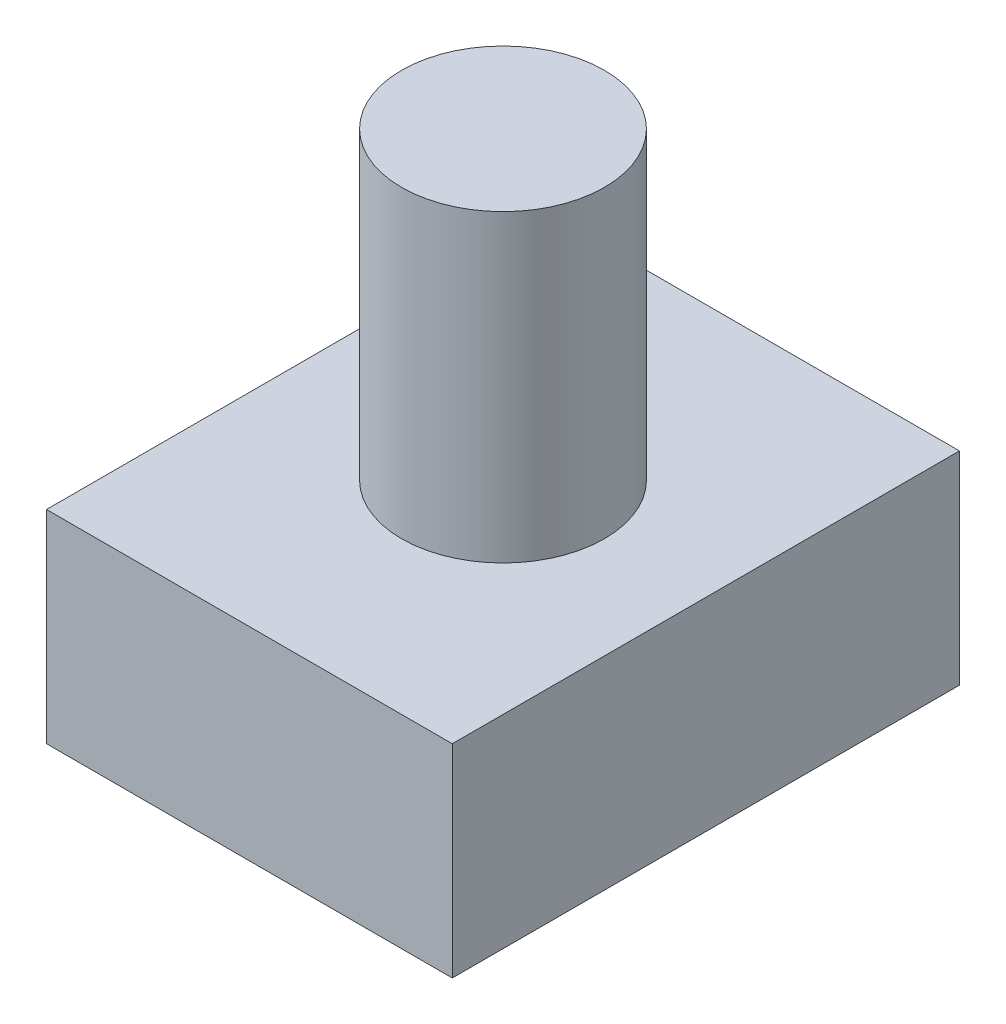
ISO-10303-21;
HEADER;
FILE_DESCRIPTION(('STEP AP214'),'2;1');
FILE_NAME('part.step','',(''),(''),'','','');
FILE_SCHEMA(('AUTOMOTIVE_DESIGN { 1 0 10303 214 1 1 1 1 }'));
ENDSEC;
DATA;
#1=APPLICATION_CONTEXT('core data for automotive mechanical design processes');
#2=APPLICATION_PROTOCOL_DEFINITION('international standard','automotive_design',2000,#1);
#3=PRODUCT_CONTEXT('',#1,'mechanical');
#4=PRODUCT('Part','Part','',(#3));
#5=PRODUCT_RELATED_PRODUCT_CATEGORY('part','',(#4));
#6=PRODUCT_DEFINITION_FORMATION('','',#4);
#7=PRODUCT_DEFINITION_CONTEXT('part definition',#1,'design');
#8=PRODUCT_DEFINITION('design','',#6,#7);
#9=PRODUCT_DEFINITION_SHAPE('','',#8);
#10=(LENGTH_UNIT() NAMED_UNIT(*) SI_UNIT(.MILLI.,.METRE.));
#11=(NAMED_UNIT(*) PLANE_ANGLE_UNIT() SI_UNIT($,.RADIAN.));
#12=(NAMED_UNIT(*) SI_UNIT($,.STERADIAN.) SOLID_ANGLE_UNIT());
#13=UNCERTAINTY_MEASURE_WITH_UNIT(LENGTH_MEASURE(1.E-05),#10,'distance_accuracy_value','');
#14=(GEOMETRIC_REPRESENTATION_CONTEXT(3) GLOBAL_UNCERTAINTY_ASSIGNED_CONTEXT((#13)) GLOBAL_UNIT_ASSIGNED_CONTEXT((#10,
#11,#12)) REPRESENTATION_CONTEXT('',''));
#15=CARTESIAN_POINT('',(0.,0.,0.));
#16=DIRECTION('',(0.,0.,1.));
#17=DIRECTION('',(1.,0.,0.));
#18=AXIS2_PLACEMENT_3D('',#15,#16,#17);
#19=CARTESIAN_POINT('',(0.,20.,0.));
#20=DIRECTION('',(1.,0.,0.));
#21=DIRECTION('',(0.,0.,-1.));
#22=AXIS2_PLACEMENT_3D('',#19,#20,#21);
#23=PLANE('',#22);
#24=DIRECTION('',(0.,0.,1.));
#25=VECTOR('',#24,1.);
#26=CARTESIAN_POINT('',(0.,0.,0.));
#27=LINE('',#26,#25);
#28=CARTESIAN_POINT('',(0.,0.,-50.));
#29=VERTEX_POINT('',#28);
#30=CARTESIAN_POINT('',(0.,0.,0.));
#31=VERTEX_POINT('',#30);
#32=EDGE_CURVE('E103',#29,#31,#27,.T.);
#33=ORIENTED_EDGE('',*,*,#32,.T.);
#34=DIRECTION('',(0.,-1.,0.));
#35=VECTOR('',#34,1.);
#36=CARTESIAN_POINT('',(0.,20.,0.));
#37=LINE('',#36,#35);
#38=CARTESIAN_POINT('',(0.,20.,0.));
#39=VERTEX_POINT('',#38);
#40=EDGE_CURVE('E40',#39,#31,#37,.T.);
#41=ORIENTED_EDGE('',*,*,#40,.F.);
#42=DIRECTION('',(0.,0.,1.));
#43=VECTOR('',#42,1.);
#44=CARTESIAN_POINT('',(0.,20.,0.));
#45=LINE('',#44,#43);
#46=CARTESIAN_POINT('',(0.,20.,-50.));
#47=VERTEX_POINT('',#46);
#48=EDGE_CURVE('E90',#47,#39,#45,.T.);
#49=ORIENTED_EDGE('',*,*,#48,.F.);
#50=DIRECTION('',(0.,-1.,0.));
#51=VECTOR('',#50,1.);
#52=CARTESIAN_POINT('',(0.,20.,-50.));
#53=LINE('',#52,#51);
#54=EDGE_CURVE('E99',#47,#29,#53,.T.);
#55=ORIENTED_EDGE('',*,*,#54,.T.);
#56=EDGE_LOOP('',(#33,#41,#49,#55));
#57=FACE_BOUND('',#56,.T.);
#58=ADVANCED_FACE('F37',(#57),#23,.F.);
#59=CARTESIAN_POINT('',(0.,20.,0.));
#60=DIRECTION('',(0.,0.,-1.));
#61=DIRECTION('',(-1.,0.,0.));
#62=AXIS2_PLACEMENT_3D('',#59,#60,#61);
#63=PLANE('',#62);
#64=DIRECTION('',(1.,0.,0.));
#65=VECTOR('',#64,1.);
#66=CARTESIAN_POINT('',(0.,0.,0.));
#67=LINE('',#66,#65);
#68=CARTESIAN_POINT('',(40.,0.,0.));
#69=VERTEX_POINT('',#68);
#70=EDGE_CURVE('E95',#31,#69,#67,.T.);
#71=ORIENTED_EDGE('',*,*,#70,.T.);
#72=DIRECTION('',(0.,-1.,0.));
#73=VECTOR('',#72,1.);
#74=CARTESIAN_POINT('',(40.,20.,0.));
#75=LINE('',#74,#73);
#76=CARTESIAN_POINT('',(40.,20.,0.));
#77=VERTEX_POINT('',#76);
#78=EDGE_CURVE('E93',#77,#69,#75,.T.);
#79=ORIENTED_EDGE('',*,*,#78,.F.);
#80=DIRECTION('',(1.,0.,0.));
#81=VECTOR('',#80,1.);
#82=CARTESIAN_POINT('',(0.,20.,0.));
#83=LINE('',#82,#81);
#84=EDGE_CURVE('E85',#39,#77,#83,.T.);
#85=ORIENTED_EDGE('',*,*,#84,.F.);
#86=ORIENTED_EDGE('',*,*,#40,.T.);
#87=EDGE_LOOP('',(#71,#79,#85,#86));
#88=FACE_BOUND('',#87,.T.);
#89=ADVANCED_FACE('F94',(#88),#63,.F.);
#90=CARTESIAN_POINT('',(40.,20.,0.));
#91=DIRECTION('',(-1.,0.,0.));
#92=DIRECTION('',(0.,0.,1.));
#93=AXIS2_PLACEMENT_3D('',#90,#91,#92);
#94=PLANE('',#93);
#95=DIRECTION('',(0.,0.,-1.));
#96=VECTOR('',#95,1.);
#97=CARTESIAN_POINT('',(40.,0.,0.));
#98=LINE('',#97,#96);
#99=CARTESIAN_POINT('',(40.,0.,-50.));
#100=VERTEX_POINT('',#99);
#101=EDGE_CURVE('E71',#69,#100,#98,.T.);
#102=ORIENTED_EDGE('',*,*,#101,.T.);
#103=DIRECTION('',(0.,-1.,0.));
#104=VECTOR('',#103,1.);
#105=CARTESIAN_POINT('',(40.,20.,-50.));
#106=LINE('',#105,#104);
#107=CARTESIAN_POINT('',(40.,20.,-50.));
#108=VERTEX_POINT('',#107);
#109=EDGE_CURVE('E96',#108,#100,#106,.T.);
#110=ORIENTED_EDGE('',*,*,#109,.F.);
#111=DIRECTION('',(0.,0.,-1.));
#112=VECTOR('',#111,1.);
#113=CARTESIAN_POINT('',(40.,20.,0.));
#114=LINE('',#113,#112);
#115=EDGE_CURVE('E88',#77,#108,#114,.T.);
#116=ORIENTED_EDGE('',*,*,#115,.F.);
#117=ORIENTED_EDGE('',*,*,#78,.T.);
#118=EDGE_LOOP('',(#102,#110,#116,#117));
#119=FACE_BOUND('',#118,.T.);
#120=ADVANCED_FACE('F97',(#119),#94,.F.);
#121=CARTESIAN_POINT('',(0.,20.,-50.));
#122=DIRECTION('',(0.,0.,1.));
#123=DIRECTION('',(1.,0.,0.));
#124=AXIS2_PLACEMENT_3D('',#121,#122,#123);
#125=PLANE('',#124);
#126=DIRECTION('',(-1.,0.,0.));
#127=VECTOR('',#126,1.);
#128=CARTESIAN_POINT('',(0.,0.,-50.));
#129=LINE('',#128,#127);
#130=EDGE_CURVE('E77',#100,#29,#129,.T.);
#131=ORIENTED_EDGE('',*,*,#130,.T.);
#132=ORIENTED_EDGE('',*,*,#54,.F.);
#133=DIRECTION('',(-1.,0.,0.));
#134=VECTOR('',#133,1.);
#135=CARTESIAN_POINT('',(0.,20.,-50.));
#136=LINE('',#135,#134);
#137=EDGE_CURVE('E54',#108,#47,#136,.T.);
#138=ORIENTED_EDGE('',*,*,#137,.F.);
#139=ORIENTED_EDGE('',*,*,#109,.T.);
#140=EDGE_LOOP('',(#131,#132,#138,#139));
#141=FACE_BOUND('',#140,.T.);
#142=ADVANCED_FACE('F111',(#141),#125,.F.);
#143=CARTESIAN_POINT('',(0.,20.,0.));
#144=DIRECTION('',(0.,-1.,0.));
#145=DIRECTION('',(0.,0.,-1.));
#146=AXIS2_PLACEMENT_3D('',#143,#144,#145);
#147=PLANE('',#146);
#148=CARTESIAN_POINT('',(20.,20.,-25.));
#149=DIRECTION('',(0.,1.,0.));
#150=DIRECTION('',(0.,0.,1.));
#151=AXIS2_PLACEMENT_3D('',#148,#149,#150);
#152=CIRCLE('',#151,10.);
#153=CARTESIAN_POINT('',(20.,20.,-15.));
#154=VERTEX_POINT('',#153);
#155=EDGE_CURVE('E11',#154,#154,#152,.T.);
#156=ORIENTED_EDGE('',*,*,#155,.F.);
#157=EDGE_LOOP('',(#156));
#158=FACE_BOUND('',#157,.T.);
#159=ORIENTED_EDGE('',*,*,#48,.T.);
#160=ORIENTED_EDGE('',*,*,#84,.T.);
#161=ORIENTED_EDGE('',*,*,#115,.T.);
#162=ORIENTED_EDGE('',*,*,#137,.T.);
#163=EDGE_LOOP('',(#159,#160,#161,#162));
#164=FACE_BOUND('',#163,.T.);
#165=ADVANCED_FACE('F86',(#158,#164),#147,.F.);
#166=CARTESIAN_POINT('',(0.,0.,0.));
#167=DIRECTION('',(0.,-1.,0.));
#168=DIRECTION('',(0.,0.,-1.));
#169=AXIS2_PLACEMENT_3D('',#166,#167,#168);
#170=PLANE('',#169);
#171=ORIENTED_EDGE('',*,*,#32,.F.);
#172=ORIENTED_EDGE('',*,*,#130,.F.);
#173=ORIENTED_EDGE('',*,*,#101,.F.);
#174=ORIENTED_EDGE('',*,*,#70,.F.);
#175=EDGE_LOOP('',(#171,#172,#173,#174));
#176=FACE_BOUND('',#175,.T.);
#177=ADVANCED_FACE('F114',(#176),#170,.T.);
#178=CARTESIAN_POINT('',(20.,50.,-25.));
#179=DIRECTION('',(0.,-1.,0.));
#180=DIRECTION('',(0.,0.,-1.));
#181=AXIS2_PLACEMENT_3D('',#178,#179,#180);
#182=CYLINDRICAL_SURFACE('',#181,10.);
#183=CARTESIAN_POINT('',(20.,50.,-25.));
#184=DIRECTION('',(0.,1.,0.));
#185=DIRECTION('',(0.,0.,1.));
#186=AXIS2_PLACEMENT_3D('',#183,#184,#185);
#187=CIRCLE('',#186,10.);
#188=CARTESIAN_POINT('',(20.,50.,-15.));
#189=VERTEX_POINT('',#188);
#190=EDGE_CURVE('E106',#189,#189,#187,.T.);
#191=ORIENTED_EDGE('',*,*,#190,.F.);
#192=EDGE_LOOP('',(#191));
#193=FACE_BOUND('',#192,.T.);
#194=ORIENTED_EDGE('',*,*,#155,.T.);
#195=EDGE_LOOP('',(#194));
#196=FACE_BOUND('',#195,.T.);
#197=ADVANCED_FACE('F122',(#193,#196),#182,.T.);
#198=CARTESIAN_POINT('',(20.,50.,-25.));
#199=DIRECTION('',(0.,1.,0.));
#200=DIRECTION('',(0.,0.,1.));
#201=AXIS2_PLACEMENT_3D('',#198,#199,#200);
#202=PLANE('',#201);
#203=ORIENTED_EDGE('',*,*,#190,.T.);
#204=EDGE_LOOP('',(#203));
#205=FACE_BOUND('',#204,.T.);
#206=ADVANCED_FACE('F120',(#205),#202,.T.);
#207=CLOSED_SHELL('',(#58,#89,#120,#142,#165,#177,#197,#206));
#208=MANIFOLD_SOLID_BREP('B2',#207);
#209=ADVANCED_BREP_SHAPE_REPRESENTATION('',(#18,#208),#14);
#210=SHAPE_DEFINITION_REPRESENTATION(#9,#209);
ENDSEC;
END-ISO-10303-21;
